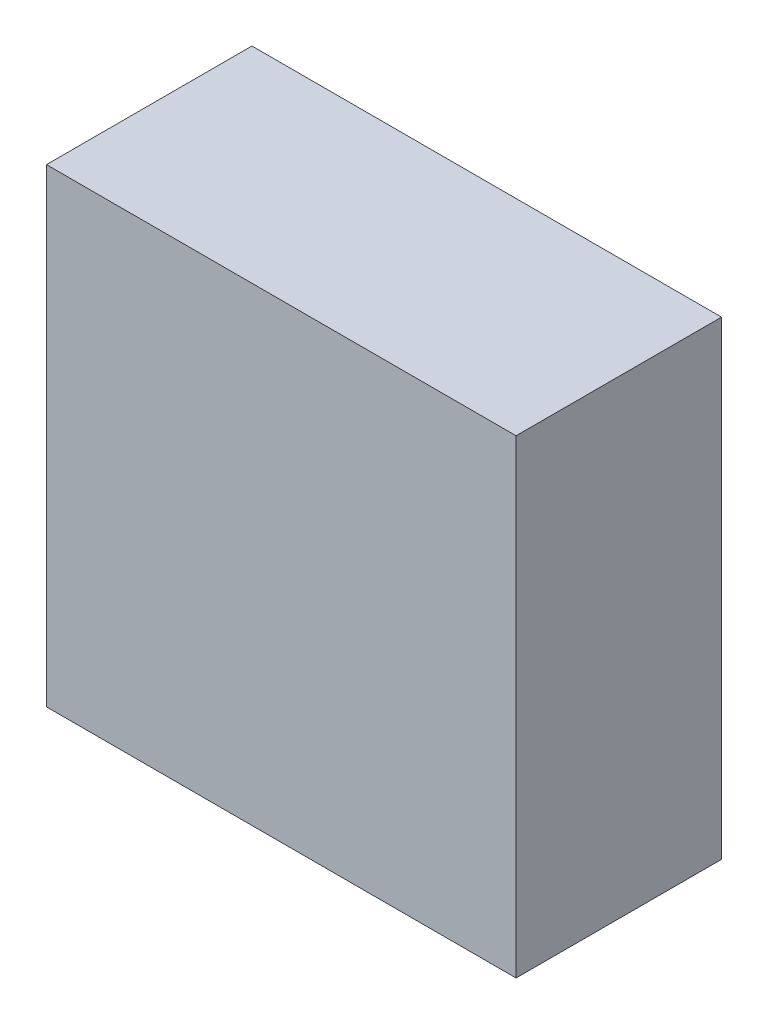
ISO-10303-21;
HEADER;
FILE_DESCRIPTION(('STEP AP214'),'2;1');
FILE_NAME('part.step','',(''),(''),'','','');
FILE_SCHEMA(('AUTOMOTIVE_DESIGN { 1 0 10303 214 1 1 1 1 }'));
ENDSEC;
DATA;
#1=APPLICATION_CONTEXT('core data for automotive mechanical design processes');
#2=APPLICATION_PROTOCOL_DEFINITION('international standard','automotive_design',2000,#1);
#3=PRODUCT_CONTEXT('',#1,'mechanical');
#4=PRODUCT('Part','Part','',(#3));
#5=PRODUCT_RELATED_PRODUCT_CATEGORY('part','',(#4));
#6=PRODUCT_DEFINITION_FORMATION('','',#4);
#7=PRODUCT_DEFINITION_CONTEXT('part definition',#1,'design');
#8=PRODUCT_DEFINITION('design','',#6,#7);
#9=PRODUCT_DEFINITION_SHAPE('','',#8);
#10=(LENGTH_UNIT() NAMED_UNIT(*) SI_UNIT(.MILLI.,.METRE.));
#11=(NAMED_UNIT(*) PLANE_ANGLE_UNIT() SI_UNIT($,.RADIAN.));
#12=(NAMED_UNIT(*) SI_UNIT($,.STERADIAN.) SOLID_ANGLE_UNIT());
#13=UNCERTAINTY_MEASURE_WITH_UNIT(LENGTH_MEASURE(1.E-05),#10,'distance_accuracy_value','');
#14=(GEOMETRIC_REPRESENTATION_CONTEXT(3) GLOBAL_UNCERTAINTY_ASSIGNED_CONTEXT((#13)) GLOBAL_UNIT_ASSIGNED_CONTEXT((#10,
#11,#12)) REPRESENTATION_CONTEXT('',''));
#15=CARTESIAN_POINT('',(0.,0.,0.));
#16=DIRECTION('',(0.,0.,1.));
#17=DIRECTION('',(1.,0.,0.));
#18=AXIS2_PLACEMENT_3D('',#15,#16,#17);
#19=CARTESIAN_POINT('',(-40.,40.,35.));
#20=DIRECTION('',(1.,0.,0.));
#21=DIRECTION('',(0.,1.,0.));
#22=AXIS2_PLACEMENT_3D('',#19,#20,#21);
#23=PLANE('',#22);
#24=DIRECTION('',(0.,-1.,0.));
#25=VECTOR('',#24,1.);
#26=CARTESIAN_POINT('',(-40.,40.,0.));
#27=LINE('',#26,#25);
#28=CARTESIAN_POINT('',(-40.,40.,0.));
#29=VERTEX_POINT('',#28);
#30=CARTESIAN_POINT('',(-40.,-40.,0.));
#31=VERTEX_POINT('',#30);
#32=EDGE_CURVE('E107',#29,#31,#27,.T.);
#33=ORIENTED_EDGE('',*,*,#32,.T.);
#34=DIRECTION('',(0.,0.,-1.));
#35=VECTOR('',#34,1.);
#36=CARTESIAN_POINT('',(-40.,-40.,35.));
#37=LINE('',#36,#35);
#38=CARTESIAN_POINT('',(-40.,-40.,35.));
#39=VERTEX_POINT('',#38);
#40=EDGE_CURVE('E11',#39,#31,#37,.T.);
#41=ORIENTED_EDGE('',*,*,#40,.F.);
#42=DIRECTION('',(0.,-1.,0.));
#43=VECTOR('',#42,1.);
#44=CARTESIAN_POINT('',(-40.,40.,35.));
#45=LINE('',#44,#43);
#46=CARTESIAN_POINT('',(-40.,40.,35.));
#47=VERTEX_POINT('',#46);
#48=EDGE_CURVE('E91',#47,#39,#45,.T.);
#49=ORIENTED_EDGE('',*,*,#48,.F.);
#50=DIRECTION('',(0.,0.,-1.));
#51=VECTOR('',#50,1.);
#52=CARTESIAN_POINT('',(-40.,40.,35.));
#53=LINE('',#52,#51);
#54=EDGE_CURVE('E103',#47,#29,#53,.T.);
#55=ORIENTED_EDGE('',*,*,#54,.T.);
#56=EDGE_LOOP('',(#33,#41,#49,#55));
#57=FACE_BOUND('',#56,.T.);
#58=ADVANCED_FACE('F39',(#57),#23,.F.);
#59=CARTESIAN_POINT('',(40.,-40.,35.));
#60=DIRECTION('',(0.,1.,0.));
#61=DIRECTION('',(-1.,0.,0.));
#62=AXIS2_PLACEMENT_3D('',#59,#60,#61);
#63=PLANE('',#62);
#64=DIRECTION('',(1.,0.,0.));
#65=VECTOR('',#64,1.);
#66=CARTESIAN_POINT('',(40.,-40.,0.));
#67=LINE('',#66,#65);
#68=CARTESIAN_POINT('',(40.,-40.,0.));
#69=VERTEX_POINT('',#68);
#70=EDGE_CURVE('E96',#31,#69,#67,.T.);
#71=ORIENTED_EDGE('',*,*,#70,.T.);
#72=DIRECTION('',(0.,0.,-1.));
#73=VECTOR('',#72,1.);
#74=CARTESIAN_POINT('',(40.,-40.,35.));
#75=LINE('',#74,#73);
#76=CARTESIAN_POINT('',(40.,-40.,35.));
#77=VERTEX_POINT('',#76);
#78=EDGE_CURVE('E48',#77,#69,#75,.T.);
#79=ORIENTED_EDGE('',*,*,#78,.F.);
#80=DIRECTION('',(1.,0.,0.));
#81=VECTOR('',#80,1.);
#82=CARTESIAN_POINT('',(40.,-40.,35.));
#83=LINE('',#82,#81);
#84=EDGE_CURVE('E86',#39,#77,#83,.T.);
#85=ORIENTED_EDGE('',*,*,#84,.F.);
#86=ORIENTED_EDGE('',*,*,#40,.T.);
#87=EDGE_LOOP('',(#71,#79,#85,#86));
#88=FACE_BOUND('',#87,.T.);
#89=ADVANCED_FACE('F95',(#88),#63,.F.);
#90=CARTESIAN_POINT('',(40.,40.,35.));
#91=DIRECTION('',(-1.,0.,0.));
#92=DIRECTION('',(0.,-1.,0.));
#93=AXIS2_PLACEMENT_3D('',#90,#91,#92);
#94=PLANE('',#93);
#95=DIRECTION('',(0.,1.,0.));
#96=VECTOR('',#95,1.);
#97=CARTESIAN_POINT('',(40.,40.,0.));
#98=LINE('',#97,#96);
#99=CARTESIAN_POINT('',(40.,40.,0.));
#100=VERTEX_POINT('',#99);
#101=EDGE_CURVE('E73',#69,#100,#98,.T.);
#102=ORIENTED_EDGE('',*,*,#101,.T.);
#103=DIRECTION('',(0.,0.,-1.));
#104=VECTOR('',#103,1.);
#105=CARTESIAN_POINT('',(40.,40.,35.));
#106=LINE('',#105,#104);
#107=CARTESIAN_POINT('',(40.,40.,35.));
#108=VERTEX_POINT('',#107);
#109=EDGE_CURVE('E98',#108,#100,#106,.T.);
#110=ORIENTED_EDGE('',*,*,#109,.F.);
#111=DIRECTION('',(0.,1.,0.));
#112=VECTOR('',#111,1.);
#113=CARTESIAN_POINT('',(40.,40.,35.));
#114=LINE('',#113,#112);
#115=EDGE_CURVE('E89',#77,#108,#114,.T.);
#116=ORIENTED_EDGE('',*,*,#115,.F.);
#117=ORIENTED_EDGE('',*,*,#78,.T.);
#118=EDGE_LOOP('',(#102,#110,#116,#117));
#119=FACE_BOUND('',#118,.T.);
#120=ADVANCED_FACE('F99',(#119),#94,.F.);
#121=CARTESIAN_POINT('',(40.,40.,35.));
#122=DIRECTION('',(0.,-1.,0.));
#123=DIRECTION('',(0.,0.,-1.));
#124=AXIS2_PLACEMENT_3D('',#121,#122,#123);
#125=PLANE('',#124);
#126=DIRECTION('',(-1.,0.,0.));
#127=VECTOR('',#126,1.);
#128=CARTESIAN_POINT('',(40.,40.,0.));
#129=LINE('',#128,#127);
#130=EDGE_CURVE('E79',#100,#29,#129,.T.);
#131=ORIENTED_EDGE('',*,*,#130,.T.);
#132=ORIENTED_EDGE('',*,*,#54,.F.);
#133=DIRECTION('',(-1.,0.,0.));
#134=VECTOR('',#133,1.);
#135=CARTESIAN_POINT('',(40.,40.,35.));
#136=LINE('',#135,#134);
#137=EDGE_CURVE('E56',#108,#47,#136,.T.);
#138=ORIENTED_EDGE('',*,*,#137,.F.);
#139=ORIENTED_EDGE('',*,*,#109,.T.);
#140=EDGE_LOOP('',(#131,#132,#138,#139));
#141=FACE_BOUND('',#140,.T.);
#142=ADVANCED_FACE('F120',(#141),#125,.F.);
#143=CARTESIAN_POINT('',(0.,0.,35.));
#144=DIRECTION('',(0.,0.,-1.));
#145=DIRECTION('',(-1.,0.,0.));
#146=AXIS2_PLACEMENT_3D('',#143,#144,#145);
#147=PLANE('',#146);
#148=ORIENTED_EDGE('',*,*,#48,.T.);
#149=ORIENTED_EDGE('',*,*,#84,.T.);
#150=ORIENTED_EDGE('',*,*,#115,.T.);
#151=ORIENTED_EDGE('',*,*,#137,.T.);
#152=EDGE_LOOP('',(#148,#149,#150,#151));
#153=FACE_BOUND('',#152,.T.);
#154=ADVANCED_FACE('F87',(#153),#147,.F.);
#155=CARTESIAN_POINT('',(0.,0.,0.));
#156=DIRECTION('',(0.,0.,-1.));
#157=DIRECTION('',(-1.,0.,0.));
#158=AXIS2_PLACEMENT_3D('',#155,#156,#157);
#159=PLANE('',#158);
#160=ORIENTED_EDGE('',*,*,#32,.F.);
#161=ORIENTED_EDGE('',*,*,#130,.F.);
#162=ORIENTED_EDGE('',*,*,#101,.F.);
#163=ORIENTED_EDGE('',*,*,#70,.F.);
#164=EDGE_LOOP('',(#160,#161,#162,#163));
#165=FACE_BOUND('',#164,.T.);
#166=ADVANCED_FACE('F123',(#165),#159,.T.);
#167=CLOSED_SHELL('',(#58,#89,#120,#142,#154,#166));
#168=MANIFOLD_SOLID_BREP('B2',#167);
#169=ADVANCED_BREP_SHAPE_REPRESENTATION('',(#18,#168),#14);
#170=SHAPE_DEFINITION_REPRESENTATION(#9,#169);
ENDSEC;
END-ISO-10303-21;
